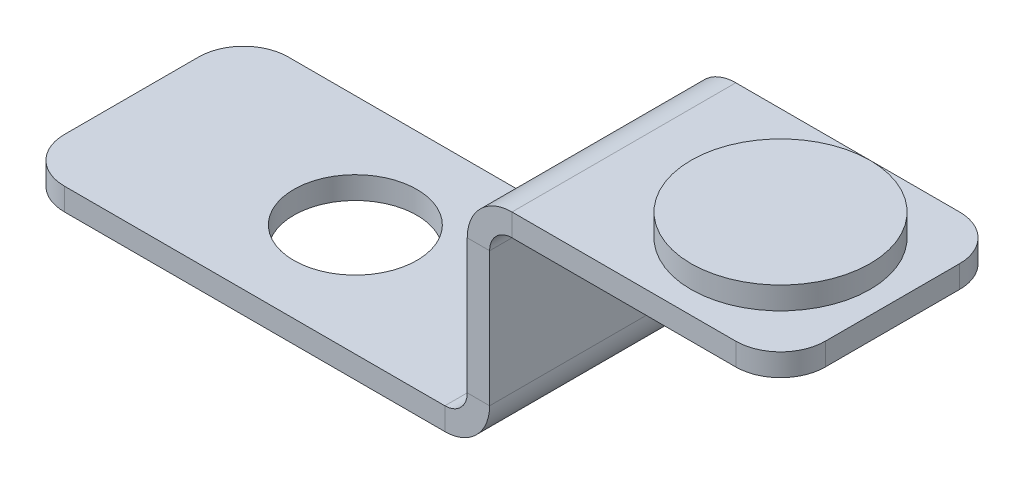
ISO-10303-21;
HEADER;
FILE_DESCRIPTION(('STEP AP214'),'2;1');
FILE_NAME('part.step','',(''),(''),'','','');
FILE_SCHEMA(('AUTOMOTIVE_DESIGN { 1 0 10303 214 1 1 1 1 }'));
ENDSEC;
DATA;
#1=APPLICATION_CONTEXT('core data for automotive mechanical design processes');
#2=APPLICATION_PROTOCOL_DEFINITION('international standard','automotive_design',2000,#1);
#3=PRODUCT_CONTEXT('',#1,'mechanical');
#4=PRODUCT('Part','Part','',(#3));
#5=PRODUCT_RELATED_PRODUCT_CATEGORY('part','',(#4));
#6=PRODUCT_DEFINITION_FORMATION('','',#4);
#7=PRODUCT_DEFINITION_CONTEXT('part definition',#1,'design');
#8=PRODUCT_DEFINITION('design','',#6,#7);
#9=PRODUCT_DEFINITION_SHAPE('','',#8);
#10=(LENGTH_UNIT() NAMED_UNIT(*) SI_UNIT(.MILLI.,.METRE.));
#11=(NAMED_UNIT(*) PLANE_ANGLE_UNIT() SI_UNIT($,.RADIAN.));
#12=(NAMED_UNIT(*) SI_UNIT($,.STERADIAN.) SOLID_ANGLE_UNIT());
#13=UNCERTAINTY_MEASURE_WITH_UNIT(LENGTH_MEASURE(1.E-05),#10,'distance_accuracy_value','');
#14=(GEOMETRIC_REPRESENTATION_CONTEXT(3) GLOBAL_UNCERTAINTY_ASSIGNED_CONTEXT((#13)) GLOBAL_UNIT_ASSIGNED_CONTEXT((#10,
#11,#12)) REPRESENTATION_CONTEXT('',''));
#15=CARTESIAN_POINT('',(0.,0.,0.));
#16=DIRECTION('',(0.,0.,1.));
#17=DIRECTION('',(1.,0.,0.));
#18=AXIS2_PLACEMENT_3D('',#15,#16,#17);
#19=CARTESIAN_POINT('',(21.0000000000001,-18.3561944901924,-2.));
#20=DIRECTION('',(-1.,0.,0.));
#21=DIRECTION('',(0.,0.,1.));
#22=AXIS2_PLACEMENT_3D('',#19,#20,#21);
#23=PLANE('',#22);
#24=DIRECTION('',(0.,-1.,0.));
#25=VECTOR('',#24,1.);
#26=CARTESIAN_POINT('',(21.0000000000001,-18.3561944901924,-10.));
#27=LINE('',#26,#25);
#28=CARTESIAN_POINT('',(21.,7.,-10.));
#29=VERTEX_POINT('',#28);
#30=CARTESIAN_POINT('',(21.,1.,-10.));
#31=VERTEX_POINT('',#30);
#32=EDGE_CURVE('E51',#29,#31,#27,.T.);
#33=ORIENTED_EDGE('',*,*,#32,.F.);
#34=DIRECTION('',(0.,0.,1.));
#35=VECTOR('',#34,1.);
#36=CARTESIAN_POINT('',(21.,7.,-2.));
#37=LINE('',#36,#35);
#38=CARTESIAN_POINT('',(21.,7.,0.));
#39=VERTEX_POINT('',#38);
#40=EDGE_CURVE('E318',#29,#39,#37,.T.);
#41=ORIENTED_EDGE('',*,*,#40,.T.);
#42=DIRECTION('',(0.,1.,0.));
#43=VECTOR('',#42,1.);
#44=CARTESIAN_POINT('',(21.,11.6438055098077,0.));
#45=LINE('',#44,#43);
#46=CARTESIAN_POINT('',(21.,1.00000000000001,0.));
#47=VERTEX_POINT('',#46);
#48=EDGE_CURVE('E329',#47,#39,#45,.T.);
#49=ORIENTED_EDGE('',*,*,#48,.F.);
#50=DIRECTION('',(0.,0.,1.));
#51=VECTOR('',#50,1.);
#52=CARTESIAN_POINT('',(21.,1.,-2.));
#53=LINE('',#52,#51);
#54=EDGE_CURVE('E305',#31,#47,#53,.T.);
#55=ORIENTED_EDGE('',*,*,#54,.F.);
#56=EDGE_LOOP('',(#33,#41,#49,#55));
#57=FACE_BOUND('',#56,.T.);
#58=ADVANCED_FACE('F47',(#57),#23,.F.);
#59=CARTESIAN_POINT('',(21.0000000000001,-18.3561944901924,-10.));
#60=DIRECTION('',(0.,0.,-1.));
#61=DIRECTION('',(0.,-1.,0.));
#62=AXIS2_PLACEMENT_3D('',#59,#60,#61);
#63=PLANE('',#62);
#64=DIRECTION('',(-1.,0.,0.));
#65=VECTOR('',#64,1.);
#66=CARTESIAN_POINT('',(21.,7.,-10.));
#67=LINE('',#66,#65);
#68=CARTESIAN_POINT('',(20.,7.,-10.));
#69=VERTEX_POINT('',#68);
#70=EDGE_CURVE('E322',#29,#69,#67,.T.);
#71=ORIENTED_EDGE('',*,*,#70,.F.);
#72=ORIENTED_EDGE('',*,*,#32,.T.);
#73=DIRECTION('',(-1.,0.,0.));
#74=VECTOR('',#73,1.);
#75=CARTESIAN_POINT('',(21.,1.,-10.));
#76=LINE('',#75,#74);
#77=CARTESIAN_POINT('',(20.,1.,-10.));
#78=VERTEX_POINT('',#77);
#79=EDGE_CURVE('E315',#31,#78,#76,.T.);
#80=ORIENTED_EDGE('',*,*,#79,.T.);
#81=DIRECTION('',(0.,-1.,0.));
#82=VECTOR('',#81,1.);
#83=CARTESIAN_POINT('',(20.0000000000001,-18.3561944901924,-10.));
#84=LINE('',#83,#82);
#85=EDGE_CURVE('E73',#69,#78,#84,.T.);
#86=ORIENTED_EDGE('',*,*,#85,.F.);
#87=EDGE_LOOP('',(#71,#72,#80,#86));
#88=FACE_BOUND('',#87,.T.);
#89=ADVANCED_FACE('F338',(#88),#63,.T.);
#90=CARTESIAN_POINT('',(21.,11.6438055098077,0.));
#91=DIRECTION('',(0.,0.,1.));
#92=DIRECTION('',(0.,1.,0.));
#93=AXIS2_PLACEMENT_3D('',#90,#91,#92);
#94=PLANE('',#93);
#95=DIRECTION('',(1.,0.,0.));
#96=VECTOR('',#95,1.);
#97=CARTESIAN_POINT('',(21.,7.,0.));
#98=LINE('',#97,#96);
#99=CARTESIAN_POINT('',(20.,7.,0.));
#100=VERTEX_POINT('',#99);
#101=EDGE_CURVE('E12',#100,#39,#98,.T.);
#102=ORIENTED_EDGE('',*,*,#101,.F.);
#103=DIRECTION('',(0.,1.,0.));
#104=VECTOR('',#103,1.);
#105=CARTESIAN_POINT('',(20.,11.6438055098076,0.));
#106=LINE('',#105,#104);
#107=CARTESIAN_POINT('',(20.,1.,0.));
#108=VERTEX_POINT('',#107);
#109=EDGE_CURVE('E65',#108,#100,#106,.T.);
#110=ORIENTED_EDGE('',*,*,#109,.F.);
#111=DIRECTION('',(1.,0.,0.));
#112=VECTOR('',#111,1.);
#113=CARTESIAN_POINT('',(21.,1.,0.));
#114=LINE('',#113,#112);
#115=EDGE_CURVE('E309',#108,#47,#114,.T.);
#116=ORIENTED_EDGE('',*,*,#115,.T.);
#117=ORIENTED_EDGE('',*,*,#48,.T.);
#118=EDGE_LOOP('',(#102,#110,#116,#117));
#119=FACE_BOUND('',#118,.T.);
#120=ADVANCED_FACE('F49',(#119),#94,.T.);
#121=CARTESIAN_POINT('',(20.0000000000001,-18.3561944901924,-2.));
#122=DIRECTION('',(-1.,0.,0.));
#123=DIRECTION('',(0.,0.,1.));
#124=AXIS2_PLACEMENT_3D('',#121,#122,#123);
#125=PLANE('',#124);
#126=DIRECTION('',(0.,0.,1.));
#127=VECTOR('',#126,1.);
#128=CARTESIAN_POINT('',(20.,7.,-2.));
#129=LINE('',#128,#127);
#130=EDGE_CURVE('E57',#69,#100,#129,.T.);
#131=ORIENTED_EDGE('',*,*,#130,.F.);
#132=ORIENTED_EDGE('',*,*,#85,.T.);
#133=DIRECTION('',(0.,0.,1.));
#134=VECTOR('',#133,1.);
#135=CARTESIAN_POINT('',(20.,1.,-2.));
#136=LINE('',#135,#134);
#137=EDGE_CURVE('E312',#78,#108,#136,.T.);
#138=ORIENTED_EDGE('',*,*,#137,.T.);
#139=ORIENTED_EDGE('',*,*,#109,.T.);
#140=EDGE_LOOP('',(#131,#132,#138,#139));
#141=FACE_BOUND('',#140,.T.);
#142=ADVANCED_FACE('F334',(#141),#125,.T.);
#143=CARTESIAN_POINT('',(2.,-1.,-8.));
#144=DIRECTION('',(0.,1.,0.));
#145=DIRECTION('',(0.,0.,1.));
#146=AXIS2_PLACEMENT_3D('',#143,#144,#145);
#147=CYLINDRICAL_SURFACE('',#146,2.);
#148=CARTESIAN_POINT('',(2.,0.,-8.));
#149=DIRECTION('',(0.,1.,0.));
#150=DIRECTION('',(0.,0.,1.));
#151=AXIS2_PLACEMENT_3D('',#148,#149,#150);
#152=CIRCLE('',#151,2.);
#153=CARTESIAN_POINT('',(2.,0.,-10.));
#154=VERTEX_POINT('',#153);
#155=CARTESIAN_POINT('',(0.,0.,-8.));
#156=VERTEX_POINT('',#155);
#157=EDGE_CURVE('E251',#154,#156,#152,.T.);
#158=ORIENTED_EDGE('',*,*,#157,.F.);
#159=DIRECTION('',(0.,1.,0.));
#160=VECTOR('',#159,1.);
#161=CARTESIAN_POINT('',(2.,-1.,-10.));
#162=LINE('',#161,#160);
#163=CARTESIAN_POINT('',(2.,-1.,-10.));
#164=VERTEX_POINT('',#163);
#165=EDGE_CURVE('E233',#164,#154,#162,.T.);
#166=ORIENTED_EDGE('',*,*,#165,.F.);
#167=CARTESIAN_POINT('',(2.,-1.,-8.));
#168=DIRECTION('',(0.,1.,0.));
#169=DIRECTION('',(0.,0.,1.));
#170=AXIS2_PLACEMENT_3D('',#167,#168,#169);
#171=CIRCLE('',#170,2.);
#172=CARTESIAN_POINT('',(0.,-1.,-8.));
#173=VERTEX_POINT('',#172);
#174=EDGE_CURVE('E290',#164,#173,#171,.T.);
#175=ORIENTED_EDGE('',*,*,#174,.T.);
#176=DIRECTION('',(0.,1.,0.));
#177=VECTOR('',#176,1.);
#178=CARTESIAN_POINT('',(0.,-1.,-8.));
#179=LINE('',#178,#177);
#180=EDGE_CURVE('E287',#173,#156,#179,.T.);
#181=ORIENTED_EDGE('',*,*,#180,.T.);
#182=EDGE_LOOP('',(#158,#166,#175,#181));
#183=FACE_BOUND('',#182,.T.);
#184=ADVANCED_FACE('F378',(#183),#147,.T.);
#185=CARTESIAN_POINT('',(0.,-1.,-2.));
#186=DIRECTION('',(-1.,0.,0.));
#187=DIRECTION('',(0.,0.,1.));
#188=AXIS2_PLACEMENT_3D('',#185,#186,#187);
#189=PLANE('',#188);
#190=DIRECTION('',(0.,0.,1.));
#191=VECTOR('',#190,1.);
#192=CARTESIAN_POINT('',(0.,0.,-2.));
#193=LINE('',#192,#191);
#194=CARTESIAN_POINT('',(0.,0.,-2.));
#195=VERTEX_POINT('',#194);
#196=EDGE_CURVE('E247',#156,#195,#193,.T.);
#197=ORIENTED_EDGE('',*,*,#196,.F.);
#198=ORIENTED_EDGE('',*,*,#180,.F.);
#199=DIRECTION('',(0.,0.,1.));
#200=VECTOR('',#199,1.);
#201=CARTESIAN_POINT('',(0.,-1.,-2.));
#202=LINE('',#201,#200);
#203=CARTESIAN_POINT('',(0.,-1.,-2.));
#204=VERTEX_POINT('',#203);
#205=EDGE_CURVE('E283',#173,#204,#202,.T.);
#206=ORIENTED_EDGE('',*,*,#205,.T.);
#207=DIRECTION('',(0.,1.,0.));
#208=VECTOR('',#207,1.);
#209=CARTESIAN_POINT('',(0.,-1.,-2.));
#210=LINE('',#209,#208);
#211=EDGE_CURVE('E280',#204,#195,#210,.T.);
#212=ORIENTED_EDGE('',*,*,#211,.T.);
#213=EDGE_LOOP('',(#197,#198,#206,#212));
#214=FACE_BOUND('',#213,.T.);
#215=ADVANCED_FACE('F381',(#214),#189,.T.);
#216=CARTESIAN_POINT('',(2.,-1.,-2.));
#217=DIRECTION('',(0.,1.,0.));
#218=DIRECTION('',(0.,0.,1.));
#219=AXIS2_PLACEMENT_3D('',#216,#217,#218);
#220=CYLINDRICAL_SURFACE('',#219,2.);
#221=CARTESIAN_POINT('',(2.,0.,-2.));
#222=DIRECTION('',(0.,1.,0.));
#223=DIRECTION('',(0.,0.,1.));
#224=AXIS2_PLACEMENT_3D('',#221,#222,#223);
#225=CIRCLE('',#224,2.);
#226=CARTESIAN_POINT('',(2.,0.,0.));
#227=VERTEX_POINT('',#226);
#228=EDGE_CURVE('E243',#195,#227,#225,.T.);
#229=ORIENTED_EDGE('',*,*,#228,.F.);
#230=ORIENTED_EDGE('',*,*,#211,.F.);
#231=CARTESIAN_POINT('',(2.,-1.,-2.));
#232=DIRECTION('',(0.,1.,0.));
#233=DIRECTION('',(0.,0.,1.));
#234=AXIS2_PLACEMENT_3D('',#231,#232,#233);
#235=CIRCLE('',#234,2.);
#236=CARTESIAN_POINT('',(2.,-1.,0.));
#237=VERTEX_POINT('',#236);
#238=EDGE_CURVE('E276',#204,#237,#235,.T.);
#239=ORIENTED_EDGE('',*,*,#238,.T.);
#240=DIRECTION('',(0.,1.,0.));
#241=VECTOR('',#240,1.);
#242=CARTESIAN_POINT('',(2.,-1.,0.));
#243=LINE('',#242,#241);
#244=EDGE_CURVE('E273',#237,#227,#243,.T.);
#245=ORIENTED_EDGE('',*,*,#244,.T.);
#246=EDGE_LOOP('',(#229,#230,#239,#245));
#247=FACE_BOUND('',#246,.T.);
#248=ADVANCED_FACE('F383',(#247),#220,.T.);
#249=CARTESIAN_POINT('',(10.,-1.,-5.));
#250=DIRECTION('',(0.,1.,0.));
#251=DIRECTION('',(0.,0.,1.));
#252=AXIS2_PLACEMENT_3D('',#249,#250,#251);
#253=CYLINDRICAL_SURFACE('',#252,2.75);
#254=CARTESIAN_POINT('',(10.,-1.,-5.));
#255=DIRECTION('',(0.,1.,0.));
#256=DIRECTION('',(0.,0.,1.));
#257=AXIS2_PLACEMENT_3D('',#254,#255,#256);
#258=CIRCLE('',#257,2.75);
#259=CARTESIAN_POINT('',(10.,-1.,-2.25));
#260=VERTEX_POINT('',#259);
#261=EDGE_CURVE('E265',#260,#260,#258,.T.);
#262=ORIENTED_EDGE('',*,*,#261,.F.);
#263=EDGE_LOOP('',(#262));
#264=FACE_BOUND('',#263,.T.);
#265=CARTESIAN_POINT('',(10.,0.,-5.));
#266=DIRECTION('',(0.,1.,0.));
#267=DIRECTION('',(0.,0.,1.));
#268=AXIS2_PLACEMENT_3D('',#265,#266,#267);
#269=CIRCLE('',#268,2.75);
#270=CARTESIAN_POINT('',(10.,0.,-2.25));
#271=VERTEX_POINT('',#270);
#272=EDGE_CURVE('E269',#271,#271,#269,.T.);
#273=ORIENTED_EDGE('',*,*,#272,.T.);
#274=EDGE_LOOP('',(#273));
#275=FACE_BOUND('',#274,.T.);
#276=ADVANCED_FACE('F385',(#264,#275),#253,.F.);
#277=CARTESIAN_POINT('',(2.,-1.,-2.));
#278=DIRECTION('',(0.,1.,0.));
#279=DIRECTION('',(0.,0.,1.));
#280=AXIS2_PLACEMENT_3D('',#277,#278,#279);
#281=PLANE('',#280);
#282=ORIENTED_EDGE('',*,*,#261,.T.);
#283=EDGE_LOOP('',(#282));
#284=FACE_BOUND('',#283,.T.);
#285=DIRECTION('',(-1.,0.,0.));
#286=VECTOR('',#285,1.);
#287=CARTESIAN_POINT('',(2.,-1.,-10.));
#288=LINE('',#287,#286);
#289=CARTESIAN_POINT('',(19.,-1.,-10.));
#290=VERTEX_POINT('',#289);
#291=EDGE_CURVE('E237',#290,#164,#288,.T.);
#292=ORIENTED_EDGE('',*,*,#291,.F.);
#293=DIRECTION('',(0.,0.,1.));
#294=VECTOR('',#293,1.);
#295=CARTESIAN_POINT('',(19.,-1.,-2.));
#296=LINE('',#295,#294);
#297=CARTESIAN_POINT('',(19.,-1.,0.));
#298=VERTEX_POINT('',#297);
#299=EDGE_CURVE('E261',#290,#298,#296,.T.);
#300=ORIENTED_EDGE('',*,*,#299,.T.);
#301=DIRECTION('',(1.,0.,0.));
#302=VECTOR('',#301,1.);
#303=CARTESIAN_POINT('',(32.,-1.,0.));
#304=LINE('',#303,#302);
#305=EDGE_CURVE('E258',#237,#298,#304,.T.);
#306=ORIENTED_EDGE('',*,*,#305,.F.);
#307=ORIENTED_EDGE('',*,*,#238,.F.);
#308=ORIENTED_EDGE('',*,*,#205,.F.);
#309=ORIENTED_EDGE('',*,*,#174,.F.);
#310=EDGE_LOOP('',(#292,#300,#306,#307,#308,#309));
#311=FACE_BOUND('',#310,.T.);
#312=ADVANCED_FACE('F373',(#284,#311),#281,.F.);
#313=CARTESIAN_POINT('',(32.,-1.,0.));
#314=DIRECTION('',(0.,0.,1.));
#315=DIRECTION('',(1.,0.,0.));
#316=AXIS2_PLACEMENT_3D('',#313,#314,#315);
#317=PLANE('',#316);
#318=DIRECTION('',(0.,-1.,0.));
#319=VECTOR('',#318,1.);
#320=CARTESIAN_POINT('',(19.,-1.,0.));
#321=LINE('',#320,#319);
#322=CARTESIAN_POINT('',(19.,0.,0.));
#323=VERTEX_POINT('',#322);
#324=EDGE_CURVE('E294',#323,#298,#321,.T.);
#325=ORIENTED_EDGE('',*,*,#324,.F.);
#326=DIRECTION('',(1.,0.,0.));
#327=VECTOR('',#326,1.);
#328=CARTESIAN_POINT('',(32.,0.,0.));
#329=LINE('',#328,#327);
#330=EDGE_CURVE('E240',#227,#323,#329,.T.);
#331=ORIENTED_EDGE('',*,*,#330,.F.);
#332=ORIENTED_EDGE('',*,*,#244,.F.);
#333=ORIENTED_EDGE('',*,*,#305,.T.);
#334=EDGE_LOOP('',(#325,#331,#332,#333));
#335=FACE_BOUND('',#334,.T.);
#336=ADVANCED_FACE('F361',(#335),#317,.T.);
#337=CARTESIAN_POINT('',(2.,0.,-2.));
#338=DIRECTION('',(0.,1.,0.));
#339=DIRECTION('',(0.,0.,1.));
#340=AXIS2_PLACEMENT_3D('',#337,#338,#339);
#341=PLANE('',#340);
#342=DIRECTION('',(0.,0.,1.));
#343=VECTOR('',#342,1.);
#344=CARTESIAN_POINT('',(19.,0.,-2.));
#345=LINE('',#344,#343);
#346=CARTESIAN_POINT('',(19.,0.,-10.));
#347=VERTEX_POINT('',#346);
#348=EDGE_CURVE('E298',#347,#323,#345,.T.);
#349=ORIENTED_EDGE('',*,*,#348,.F.);
#350=DIRECTION('',(-1.,0.,0.));
#351=VECTOR('',#350,1.);
#352=CARTESIAN_POINT('',(2.,0.,-10.));
#353=LINE('',#352,#351);
#354=EDGE_CURVE('E255',#347,#154,#353,.T.);
#355=ORIENTED_EDGE('',*,*,#354,.T.);
#356=ORIENTED_EDGE('',*,*,#157,.T.);
#357=ORIENTED_EDGE('',*,*,#196,.T.);
#358=ORIENTED_EDGE('',*,*,#228,.T.);
#359=ORIENTED_EDGE('',*,*,#330,.T.);
#360=EDGE_LOOP('',(#349,#355,#356,#357,#358,#359));
#361=FACE_BOUND('',#360,.T.);
#362=ORIENTED_EDGE('',*,*,#272,.F.);
#363=EDGE_LOOP('',(#362));
#364=FACE_BOUND('',#363,.T.);
#365=ADVANCED_FACE('F355',(#361,#364),#341,.T.);
#366=CARTESIAN_POINT('',(2.,-1.,-10.));
#367=DIRECTION('',(0.,0.,-1.));
#368=DIRECTION('',(-1.,0.,0.));
#369=AXIS2_PLACEMENT_3D('',#366,#367,#368);
#370=PLANE('',#369);
#371=DIRECTION('',(0.,1.,0.));
#372=VECTOR('',#371,1.);
#373=CARTESIAN_POINT('',(19.,-1.,-10.));
#374=LINE('',#373,#372);
#375=EDGE_CURVE('E226',#290,#347,#374,.T.);
#376=ORIENTED_EDGE('',*,*,#375,.F.);
#377=ORIENTED_EDGE('',*,*,#291,.T.);
#378=ORIENTED_EDGE('',*,*,#165,.T.);
#379=ORIENTED_EDGE('',*,*,#354,.F.);
#380=EDGE_LOOP('',(#376,#377,#378,#379));
#381=FACE_BOUND('',#380,.T.);
#382=ADVANCED_FACE('F350',(#381),#370,.T.);
#383=CARTESIAN_POINT('',(19.,1.,-10.));
#384=DIRECTION('',(0.,0.,-1.));
#385=DIRECTION('',(-1.,0.,0.));
#386=AXIS2_PLACEMENT_3D('',#383,#384,#385);
#387=PLANE('',#386);
#388=ORIENTED_EDGE('',*,*,#375,.T.);
#389=CARTESIAN_POINT('',(19.,1.,-10.));
#390=DIRECTION('',(0.,0.,1.));
#391=DIRECTION('',(1.,0.,0.));
#392=AXIS2_PLACEMENT_3D('',#389,#390,#391);
#393=CIRCLE('',#392,1.);
#394=EDGE_CURVE('E210',#347,#78,#393,.T.);
#395=ORIENTED_EDGE('',*,*,#394,.T.);
#396=ORIENTED_EDGE('',*,*,#79,.F.);
#397=CARTESIAN_POINT('',(19.,1.,-10.));
#398=DIRECTION('',(0.,0.,1.));
#399=DIRECTION('',(-1.,0.,0.));
#400=AXIS2_PLACEMENT_3D('',#397,#398,#399);
#401=CIRCLE('',#400,2.);
#402=EDGE_CURVE('E217',#290,#31,#401,.T.);
#403=ORIENTED_EDGE('',*,*,#402,.F.);
#404=EDGE_LOOP('',(#388,#395,#396,#403));
#405=FACE_BOUND('',#404,.T.);
#406=ADVANCED_FACE('F346',(#405),#387,.T.);
#407=CARTESIAN_POINT('',(19.,1.,0.));
#408=DIRECTION('',(0.,0.,1.));
#409=DIRECTION('',(1.,0.,0.));
#410=AXIS2_PLACEMENT_3D('',#407,#408,#409);
#411=PLANE('',#410);
#412=ORIENTED_EDGE('',*,*,#115,.F.);
#413=CARTESIAN_POINT('',(19.,1.,0.));
#414=DIRECTION('',(0.,0.,1.));
#415=DIRECTION('',(1.,0.,0.));
#416=AXIS2_PLACEMENT_3D('',#413,#414,#415);
#417=CIRCLE('',#416,1.);
#418=EDGE_CURVE('E222',#108,#323,#417,.F.);
#419=ORIENTED_EDGE('',*,*,#418,.T.);
#420=ORIENTED_EDGE('',*,*,#324,.T.);
#421=CARTESIAN_POINT('',(19.,1.,0.));
#422=DIRECTION('',(0.,0.,-1.));
#423=DIRECTION('',(1.,0.,0.));
#424=AXIS2_PLACEMENT_3D('',#421,#422,#423);
#425=CIRCLE('',#424,2.);
#426=EDGE_CURVE('E221',#47,#298,#425,.T.);
#427=ORIENTED_EDGE('',*,*,#426,.F.);
#428=EDGE_LOOP('',(#412,#419,#420,#427));
#429=FACE_BOUND('',#428,.T.);
#430=ADVANCED_FACE('F365',(#429),#411,.T.);
#431=CARTESIAN_POINT('',(19.,1.,-15.3223859875328));
#432=DIRECTION('',(0.,0.,1.));
#433=DIRECTION('',(1.,0.,0.));
#434=AXIS2_PLACEMENT_3D('',#431,#432,#433);
#435=CYLINDRICAL_SURFACE('',#434,2.);
#436=ORIENTED_EDGE('',*,*,#426,.T.);
#437=ORIENTED_EDGE('',*,*,#299,.F.);
#438=ORIENTED_EDGE('',*,*,#402,.T.);
#439=ORIENTED_EDGE('',*,*,#54,.T.);
#440=EDGE_LOOP('',(#436,#437,#438,#439));
#441=FACE_BOUND('',#440,.T.);
#442=ADVANCED_FACE('F371',(#441),#435,.T.);
#443=CARTESIAN_POINT('',(19.,1.,-15.3223859875328));
#444=DIRECTION('',(0.,0.,1.));
#445=DIRECTION('',(1.,0.,0.));
#446=AXIS2_PLACEMENT_3D('',#443,#444,#445);
#447=CYLINDRICAL_SURFACE('',#446,1.);
#448=ORIENTED_EDGE('',*,*,#418,.F.);
#449=ORIENTED_EDGE('',*,*,#137,.F.);
#450=ORIENTED_EDGE('',*,*,#394,.F.);
#451=ORIENTED_EDGE('',*,*,#348,.T.);
#452=EDGE_LOOP('',(#448,#449,#450,#451));
#453=FACE_BOUND('',#452,.T.);
#454=ADVANCED_FACE('F345',(#453),#447,.F.);
#455=CARTESIAN_POINT('',(22.,7.00000000000001,-10.));
#456=DIRECTION('',(0.,0.,1.));
#457=DIRECTION('',(1.,0.,0.));
#458=AXIS2_PLACEMENT_3D('',#455,#456,#457);
#459=PLANE('',#458);
#460=ORIENTED_EDGE('',*,*,#70,.T.);
#461=CARTESIAN_POINT('',(22.,7.00000000000001,-10.));
#462=DIRECTION('',(0.,0.,1.));
#463=DIRECTION('',(1.,0.,0.));
#464=AXIS2_PLACEMENT_3D('',#461,#462,#463);
#465=CIRCLE('',#464,2.);
#466=CARTESIAN_POINT('',(22.,9.00000000000001,-10.));
#467=VERTEX_POINT('',#466);
#468=EDGE_CURVE('E183',#69,#467,#465,.F.);
#469=ORIENTED_EDGE('',*,*,#468,.T.);
#470=DIRECTION('',(0.,1.,0.));
#471=VECTOR('',#470,1.);
#472=CARTESIAN_POINT('',(22.,8.00000000000001,-10.));
#473=LINE('',#472,#471);
#474=CARTESIAN_POINT('',(22.,8.00000000000001,-10.));
#475=VERTEX_POINT('',#474);
#476=EDGE_CURVE('E722',#475,#467,#473,.T.);
#477=ORIENTED_EDGE('',*,*,#476,.F.);
#478=CARTESIAN_POINT('',(22.,7.00000000000001,-10.));
#479=DIRECTION('',(0.,0.,-1.));
#480=DIRECTION('',(1.,0.,0.));
#481=AXIS2_PLACEMENT_3D('',#478,#479,#480);
#482=CIRCLE('',#481,1.);
#483=EDGE_CURVE('E201',#29,#475,#482,.T.);
#484=ORIENTED_EDGE('',*,*,#483,.F.);
#485=EDGE_LOOP('',(#460,#469,#477,#484));
#486=FACE_BOUND('',#485,.T.);
#487=ADVANCED_FACE('F571',(#486),#459,.F.);
#488=CARTESIAN_POINT('',(22.,7.00000000000001,0.));
#489=DIRECTION('',(0.,0.,-1.));
#490=DIRECTION('',(-1.,0.,0.));
#491=AXIS2_PLACEMENT_3D('',#488,#489,#490);
#492=PLANE('',#491);
#493=DIRECTION('',(0.,-1.,0.));
#494=VECTOR('',#493,1.);
#495=CARTESIAN_POINT('',(22.,8.00000000000001,0.));
#496=LINE('',#495,#494);
#497=CARTESIAN_POINT('',(22.,9.00000000000001,0.));
#498=VERTEX_POINT('',#497);
#499=CARTESIAN_POINT('',(22.,8.00000000000001,0.));
#500=VERTEX_POINT('',#499);
#501=EDGE_CURVE('E170',#498,#500,#496,.T.);
#502=ORIENTED_EDGE('',*,*,#501,.F.);
#503=CARTESIAN_POINT('',(22.,7.00000000000001,0.));
#504=DIRECTION('',(0.,0.,1.));
#505=DIRECTION('',(1.,0.,0.));
#506=AXIS2_PLACEMENT_3D('',#503,#504,#505);
#507=CIRCLE('',#506,2.);
#508=EDGE_CURVE('E206',#498,#100,#507,.T.);
#509=ORIENTED_EDGE('',*,*,#508,.T.);
#510=ORIENTED_EDGE('',*,*,#101,.T.);
#511=CARTESIAN_POINT('',(22.,7.00000000000001,0.));
#512=DIRECTION('',(0.,0.,1.));
#513=DIRECTION('',(-1.,0.,0.));
#514=AXIS2_PLACEMENT_3D('',#511,#512,#513);
#515=CIRCLE('',#514,1.);
#516=EDGE_CURVE('E205',#500,#39,#515,.T.);
#517=ORIENTED_EDGE('',*,*,#516,.F.);
#518=EDGE_LOOP('',(#502,#509,#510,#517));
#519=FACE_BOUND('',#518,.T.);
#520=ADVANCED_FACE('F578',(#519),#492,.F.);
#521=CARTESIAN_POINT('',(22.,7.00000000000001,-15.3223859875328));
#522=DIRECTION('',(0.,0.,1.));
#523=DIRECTION('',(1.,0.,0.));
#524=AXIS2_PLACEMENT_3D('',#521,#522,#523);
#525=CYLINDRICAL_SURFACE('',#524,1.);
#526=ORIENTED_EDGE('',*,*,#516,.T.);
#527=ORIENTED_EDGE('',*,*,#40,.F.);
#528=ORIENTED_EDGE('',*,*,#483,.T.);
#529=DIRECTION('',(0.,0.,1.));
#530=VECTOR('',#529,1.);
#531=CARTESIAN_POINT('',(22.,8.00000000000001,-2.));
#532=LINE('',#531,#530);
#533=EDGE_CURVE('E192',#475,#500,#532,.T.);
#534=ORIENTED_EDGE('',*,*,#533,.T.);
#535=EDGE_LOOP('',(#526,#527,#528,#534));
#536=FACE_BOUND('',#535,.T.);
#537=ADVANCED_FACE('F586',(#536),#525,.F.);
#538=CARTESIAN_POINT('',(22.,7.00000000000001,-15.3223859875328));
#539=DIRECTION('',(0.,0.,1.));
#540=DIRECTION('',(1.,0.,0.));
#541=AXIS2_PLACEMENT_3D('',#538,#539,#540);
#542=CYLINDRICAL_SURFACE('',#541,2.);
#543=ORIENTED_EDGE('',*,*,#508,.F.);
#544=DIRECTION('',(0.,0.,1.));
#545=VECTOR('',#544,1.);
#546=CARTESIAN_POINT('',(22.,9.00000000000001,-2.));
#547=LINE('',#546,#545);
#548=EDGE_CURVE('E715',#467,#498,#547,.T.);
#549=ORIENTED_EDGE('',*,*,#548,.F.);
#550=ORIENTED_EDGE('',*,*,#468,.F.);
#551=ORIENTED_EDGE('',*,*,#130,.T.);
#552=EDGE_LOOP('',(#543,#549,#550,#551));
#553=FACE_BOUND('',#552,.T.);
#554=ADVANCED_FACE('F474',(#553),#542,.T.);
#555=CARTESIAN_POINT('',(32.,8.00000000000001,-2.));
#556=DIRECTION('',(0.,1.,0.));
#557=DIRECTION('',(0.,0.,1.));
#558=AXIS2_PLACEMENT_3D('',#555,#556,#557);
#559=CYLINDRICAL_SURFACE('',#558,2.);
#560=CARTESIAN_POINT('',(32.,9.00000000000001,-2.));
#561=DIRECTION('',(0.,1.,0.));
#562=DIRECTION('',(0.,0.,-1.));
#563=AXIS2_PLACEMENT_3D('',#560,#561,#562);
#564=CIRCLE('',#563,2.);
#565=CARTESIAN_POINT('',(32.,9.00000000000001,0.));
#566=VERTEX_POINT('',#565);
#567=CARTESIAN_POINT('',(34.,9.00000000000001,-2.));
#568=VERTEX_POINT('',#567);
#569=EDGE_CURVE('E181',#566,#568,#564,.T.);
#570=ORIENTED_EDGE('',*,*,#569,.F.);
#571=DIRECTION('',(0.,1.,0.));
#572=VECTOR('',#571,1.);
#573=CARTESIAN_POINT('',(32.,8.00000000000001,0.));
#574=LINE('',#573,#572);
#575=CARTESIAN_POINT('',(32.,8.00000000000001,0.));
#576=VERTEX_POINT('',#575);
#577=EDGE_CURVE('E167',#576,#566,#574,.T.);
#578=ORIENTED_EDGE('',*,*,#577,.F.);
#579=CARTESIAN_POINT('',(32.,8.00000000000001,-2.));
#580=DIRECTION('',(0.,1.,0.));
#581=DIRECTION('',(0.,0.,-1.));
#582=AXIS2_PLACEMENT_3D('',#579,#580,#581);
#583=CIRCLE('',#582,2.);
#584=CARTESIAN_POINT('',(34.,8.00000000000001,-2.));
#585=VERTEX_POINT('',#584);
#586=EDGE_CURVE('E179',#576,#585,#583,.T.);
#587=ORIENTED_EDGE('',*,*,#586,.T.);
#588=DIRECTION('',(0.,1.,0.));
#589=VECTOR('',#588,1.);
#590=CARTESIAN_POINT('',(34.,8.00000000000001,-2.));
#591=LINE('',#590,#589);
#592=EDGE_CURVE('E191',#585,#568,#591,.T.);
#593=ORIENTED_EDGE('',*,*,#592,.T.);
#594=EDGE_LOOP('',(#570,#578,#587,#593));
#595=FACE_BOUND('',#594,.T.);
#596=ADVANCED_FACE('F178',(#595),#559,.T.);
#597=CARTESIAN_POINT('',(34.,8.00000000000001,-8.));
#598=DIRECTION('',(1.,0.,0.));
#599=DIRECTION('',(0.,0.,-1.));
#600=AXIS2_PLACEMENT_3D('',#597,#598,#599);
#601=PLANE('',#600);
#602=DIRECTION('',(0.,0.,-1.));
#603=VECTOR('',#602,1.);
#604=CARTESIAN_POINT('',(34.,9.00000000000001,-8.));
#605=LINE('',#604,#603);
#606=CARTESIAN_POINT('',(34.,9.00000000000001,-8.));
#607=VERTEX_POINT('',#606);
#608=EDGE_CURVE('E706',#568,#607,#605,.T.);
#609=ORIENTED_EDGE('',*,*,#608,.F.);
#610=ORIENTED_EDGE('',*,*,#592,.F.);
#611=DIRECTION('',(0.,0.,-1.));
#612=VECTOR('',#611,1.);
#613=CARTESIAN_POINT('',(34.,8.00000000000001,-8.));
#614=LINE('',#613,#612);
#615=CARTESIAN_POINT('',(34.,8.00000000000001,-8.));
#616=VERTEX_POINT('',#615);
#617=EDGE_CURVE('E189',#585,#616,#614,.T.);
#618=ORIENTED_EDGE('',*,*,#617,.T.);
#619=DIRECTION('',(0.,1.,0.));
#620=VECTOR('',#619,1.);
#621=CARTESIAN_POINT('',(34.,8.00000000000001,-8.));
#622=LINE('',#621,#620);
#623=EDGE_CURVE('E738',#616,#607,#622,.T.);
#624=ORIENTED_EDGE('',*,*,#623,.T.);
#625=EDGE_LOOP('',(#609,#610,#618,#624));
#626=FACE_BOUND('',#625,.T.);
#627=ADVANCED_FACE('F455',(#626),#601,.T.);
#628=CARTESIAN_POINT('',(32.,8.00000000000001,-8.));
#629=DIRECTION('',(0.,1.,0.));
#630=DIRECTION('',(0.,0.,1.));
#631=AXIS2_PLACEMENT_3D('',#628,#629,#630);
#632=CYLINDRICAL_SURFACE('',#631,2.);
#633=CARTESIAN_POINT('',(32.,9.00000000000001,-8.));
#634=DIRECTION('',(0.,1.,0.));
#635=DIRECTION('',(0.,0.,-1.));
#636=AXIS2_PLACEMENT_3D('',#633,#634,#635);
#637=CIRCLE('',#636,2.);
#638=CARTESIAN_POINT('',(32.,9.00000000000001,-10.));
#639=VERTEX_POINT('',#638);
#640=EDGE_CURVE('E702',#607,#639,#637,.T.);
#641=ORIENTED_EDGE('',*,*,#640,.F.);
#642=ORIENTED_EDGE('',*,*,#623,.F.);
#643=CARTESIAN_POINT('',(32.,8.00000000000001,-8.));
#644=DIRECTION('',(0.,1.,0.));
#645=DIRECTION('',(0.,0.,-1.));
#646=AXIS2_PLACEMENT_3D('',#643,#644,#645);
#647=CIRCLE('',#646,2.);
#648=CARTESIAN_POINT('',(32.,8.00000000000001,-10.));
#649=VERTEX_POINT('',#648);
#650=EDGE_CURVE('E734',#616,#649,#647,.T.);
#651=ORIENTED_EDGE('',*,*,#650,.T.);
#652=DIRECTION('',(0.,1.,0.));
#653=VECTOR('',#652,1.);
#654=CARTESIAN_POINT('',(32.,8.00000000000001,-10.));
#655=LINE('',#654,#653);
#656=EDGE_CURVE('E730',#649,#639,#655,.T.);
#657=ORIENTED_EDGE('',*,*,#656,.T.);
#658=EDGE_LOOP('',(#641,#642,#651,#657));
#659=FACE_BOUND('',#658,.T.);
#660=ADVANCED_FACE('F449',(#659),#632,.T.);
#661=CARTESIAN_POINT('',(-5.71238898038472,8.,-2.));
#662=DIRECTION('',(0.,1.,0.));
#663=DIRECTION('',(0.,0.,1.));
#664=AXIS2_PLACEMENT_3D('',#661,#662,#663);
#665=PLANE('',#664);
#666=ORIENTED_EDGE('',*,*,#533,.F.);
#667=DIRECTION('',(-1.,0.,0.));
#668=VECTOR('',#667,1.);
#669=CARTESIAN_POINT('',(-5.71238898038472,8.,-10.));
#670=LINE('',#669,#668);
#671=EDGE_CURVE('E726',#649,#475,#670,.T.);
#672=ORIENTED_EDGE('',*,*,#671,.F.);
#673=ORIENTED_EDGE('',*,*,#650,.F.);
#674=ORIENTED_EDGE('',*,*,#617,.F.);
#675=ORIENTED_EDGE('',*,*,#586,.F.);
#676=DIRECTION('',(1.,0.,0.));
#677=VECTOR('',#676,1.);
#678=CARTESIAN_POINT('',(24.2876110196153,8.,0.));
#679=LINE('',#678,#677);
#680=EDGE_CURVE('E164',#500,#576,#679,.T.);
#681=ORIENTED_EDGE('',*,*,#680,.F.);
#682=EDGE_LOOP('',(#666,#672,#673,#674,#675,#681));
#683=FACE_BOUND('',#682,.T.);
#684=ADVANCED_FACE('F186',(#683),#665,.F.);
#685=CARTESIAN_POINT('',(-5.71238898038472,8.,-10.));
#686=DIRECTION('',(0.,0.,-1.));
#687=DIRECTION('',(-1.,0.,0.));
#688=AXIS2_PLACEMENT_3D('',#685,#686,#687);
#689=PLANE('',#688);
#690=ORIENTED_EDGE('',*,*,#671,.T.);
#691=ORIENTED_EDGE('',*,*,#476,.T.);
#692=DIRECTION('',(-1.,0.,0.));
#693=VECTOR('',#692,1.);
#694=CARTESIAN_POINT('',(-5.71238898038472,9.00000000000001,-10.));
#695=LINE('',#694,#693);
#696=EDGE_CURVE('E719',#639,#467,#695,.T.);
#697=ORIENTED_EDGE('',*,*,#696,.F.);
#698=ORIENTED_EDGE('',*,*,#656,.F.);
#699=EDGE_LOOP('',(#690,#691,#697,#698));
#700=FACE_BOUND('',#699,.T.);
#701=ADVANCED_FACE('F438',(#700),#689,.T.);
#702=CARTESIAN_POINT('',(-5.71238898038472,9.00000000000001,-2.));
#703=DIRECTION('',(0.,1.,0.));
#704=DIRECTION('',(0.,0.,1.));
#705=AXIS2_PLACEMENT_3D('',#702,#703,#704);
#706=PLANE('',#705);
#707=CARTESIAN_POINT('',(29.,9.00000000000001,-5.));
#708=DIRECTION('',(0.,1.,0.));
#709=DIRECTION('',(-1.,0.,0.));
#710=AXIS2_PLACEMENT_3D('',#707,#708,#709);
#711=CIRCLE('',#710,4.);
#712=CARTESIAN_POINT('',(25.,9.00000000000001,-5.));
#713=VERTEX_POINT('',#712);
#714=EDGE_CURVE('E694',#713,#713,#711,.T.);
#715=ORIENTED_EDGE('',*,*,#714,.F.);
#716=EDGE_LOOP('',(#715));
#717=FACE_BOUND('',#716,.T.);
#718=ORIENTED_EDGE('',*,*,#696,.T.);
#719=ORIENTED_EDGE('',*,*,#548,.T.);
#720=DIRECTION('',(1.,0.,0.));
#721=VECTOR('',#720,1.);
#722=CARTESIAN_POINT('',(24.2876110196153,9.00000000000001,0.));
#723=LINE('',#722,#721);
#724=EDGE_CURVE('E712',#498,#566,#723,.T.);
#725=ORIENTED_EDGE('',*,*,#724,.T.);
#726=ORIENTED_EDGE('',*,*,#569,.T.);
#727=ORIENTED_EDGE('',*,*,#608,.T.);
#728=ORIENTED_EDGE('',*,*,#640,.T.);
#729=EDGE_LOOP('',(#718,#719,#725,#726,#727,#728));
#730=FACE_BOUND('',#729,.T.);
#731=ADVANCED_FACE('F433',(#717,#730),#706,.T.);
#732=CARTESIAN_POINT('',(24.2876110196153,8.,0.));
#733=DIRECTION('',(0.,0.,1.));
#734=DIRECTION('',(1.,0.,0.));
#735=AXIS2_PLACEMENT_3D('',#732,#733,#734);
#736=PLANE('',#735);
#737=ORIENTED_EDGE('',*,*,#724,.F.);
#738=ORIENTED_EDGE('',*,*,#501,.T.);
#739=ORIENTED_EDGE('',*,*,#680,.T.);
#740=ORIENTED_EDGE('',*,*,#577,.T.);
#741=EDGE_LOOP('',(#737,#738,#739,#740));
#742=FACE_BOUND('',#741,.T.);
#743=ADVANCED_FACE('F166',(#742),#736,.T.);
#744=CARTESIAN_POINT('',(29.,10.,-5.));
#745=DIRECTION('',(0.,-1.,0.));
#746=DIRECTION('',(1.,0.,0.));
#747=AXIS2_PLACEMENT_3D('',#744,#745,#746);
#748=CYLINDRICAL_SURFACE('',#747,4.);
#749=CARTESIAN_POINT('',(29.,10.,-5.));
#750=DIRECTION('',(0.,1.,0.));
#751=DIRECTION('',(-1.,0.,0.));
#752=AXIS2_PLACEMENT_3D('',#749,#750,#751);
#753=CIRCLE('',#752,4.);
#754=CARTESIAN_POINT('',(25.,10.,-5.));
#755=VERTEX_POINT('',#754);
#756=EDGE_CURVE('E197',#755,#755,#753,.T.);
#757=ORIENTED_EDGE('',*,*,#756,.F.);
#758=EDGE_LOOP('',(#757));
#759=FACE_BOUND('',#758,.T.);
#760=ORIENTED_EDGE('',*,*,#714,.T.);
#761=EDGE_LOOP('',(#760));
#762=FACE_BOUND('',#761,.T.);
#763=ADVANCED_FACE('F432',(#759,#762),#748,.T.);
#764=CARTESIAN_POINT('',(29.,10.,-5.));
#765=DIRECTION('',(0.,1.,0.));
#766=DIRECTION('',(-1.,0.,0.));
#767=AXIS2_PLACEMENT_3D('',#764,#765,#766);
#768=PLANE('',#767);
#769=ORIENTED_EDGE('',*,*,#756,.T.);
#770=EDGE_LOOP('',(#769));
#771=FACE_BOUND('',#770,.T.);
#772=ADVANCED_FACE('F631',(#771),#768,.T.);
#773=CLOSED_SHELL('',(#58,#89,#120,#142,#184,#215,#248,#276,#312,#336,#365,#382,#406,#430,#442,
#454,#487,#520,#537,#554,#596,#627,#660,#684,#701,#731,#743,#763,#772));
#774=MANIFOLD_SOLID_BREP('B2',#773);
#775=ADVANCED_BREP_SHAPE_REPRESENTATION('',(#18,#774),#14);
#776=SHAPE_DEFINITION_REPRESENTATION(#9,#775);
ENDSEC;
END-ISO-10303-21;
